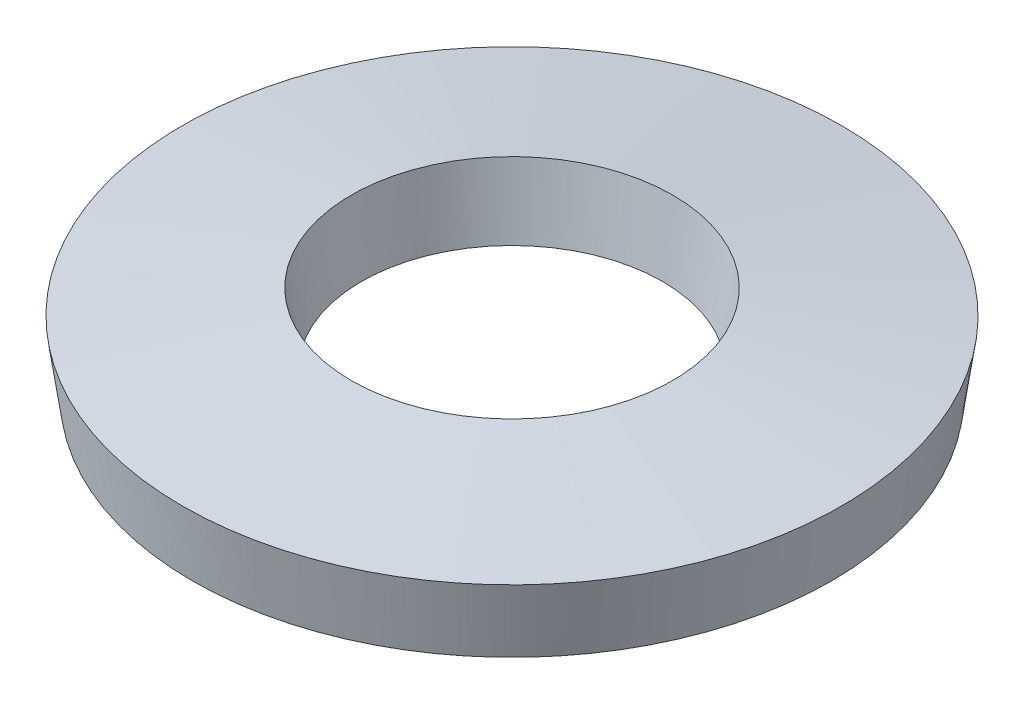
ISO-10303-21;
HEADER;
FILE_DESCRIPTION(('STEP AP214'),'2;1');
FILE_NAME('part.step','',(''),(''),'','','');
FILE_SCHEMA(('AUTOMOTIVE_DESIGN { 1 0 10303 214 1 1 1 1 }'));
ENDSEC;
DATA;
#1=APPLICATION_CONTEXT('core data for automotive mechanical design processes');
#2=APPLICATION_PROTOCOL_DEFINITION('international standard','automotive_design',2000,#1);
#3=PRODUCT_CONTEXT('',#1,'mechanical');
#4=PRODUCT('Part','Part','',(#3));
#5=PRODUCT_RELATED_PRODUCT_CATEGORY('part','',(#4));
#6=PRODUCT_DEFINITION_FORMATION('','',#4);
#7=PRODUCT_DEFINITION_CONTEXT('part definition',#1,'design');
#8=PRODUCT_DEFINITION('design','',#6,#7);
#9=PRODUCT_DEFINITION_SHAPE('','',#8);
#10=(LENGTH_UNIT() NAMED_UNIT(*) SI_UNIT(.MILLI.,.METRE.));
#11=(NAMED_UNIT(*) PLANE_ANGLE_UNIT() SI_UNIT($,.RADIAN.));
#12=(NAMED_UNIT(*) SI_UNIT($,.STERADIAN.) SOLID_ANGLE_UNIT());
#13=UNCERTAINTY_MEASURE_WITH_UNIT(LENGTH_MEASURE(1.E-05),#10,'distance_accuracy_value','');
#14=(GEOMETRIC_REPRESENTATION_CONTEXT(3) GLOBAL_UNCERTAINTY_ASSIGNED_CONTEXT((#13)) GLOBAL_UNIT_ASSIGNED_CONTEXT((#10,
#11,#12)) REPRESENTATION_CONTEXT('',''));
#15=CARTESIAN_POINT('',(0.,0.,0.));
#16=DIRECTION('',(0.,0.,1.));
#17=DIRECTION('',(1.,0.,0.));
#18=AXIS2_PLACEMENT_3D('',#15,#16,#17);
#19=CARTESIAN_POINT('',(0.,0.,0.));
#20=DIRECTION('',(0.,1.,0.));
#21=DIRECTION('',(0.,0.,1.));
#22=AXIS2_PLACEMENT_3D('',#19,#20,#21);
#23=CONICAL_SURFACE('',#22,6.786710012267,0.142676904490484);
#24=CARTESIAN_POINT('',(0.,1.48475835782556,0.));
#25=DIRECTION('',(0.,-1.,0.));
#26=DIRECTION('',(0.,0.,-1.));
#27=AXIS2_PLACEMENT_3D('',#24,#25,#26);
#28=CIRCLE('',#27,7.);
#29=CARTESIAN_POINT('',(0.,1.48475835782556,-7.));
#30=VERTEX_POINT('',#29);
#31=EDGE_CURVE('E45',#30,#30,#28,.T.);
#32=ORIENTED_EDGE('',*,*,#31,.T.);
#33=EDGE_LOOP('',(#32));
#34=FACE_BOUND('',#33,.T.);
#35=CARTESIAN_POINT('',(0.,0.,0.));
#36=DIRECTION('',(0.,-1.,0.));
#37=DIRECTION('',(0.,0.,-1.));
#38=AXIS2_PLACEMENT_3D('',#35,#36,#37);
#39=CIRCLE('',#38,6.786710012267);
#40=CARTESIAN_POINT('',(0.,0.,-6.786710012267));
#41=VERTEX_POINT('',#40);
#42=EDGE_CURVE('E10',#41,#41,#39,.T.);
#43=ORIENTED_EDGE('',*,*,#42,.F.);
#44=EDGE_LOOP('',(#43));
#45=FACE_BOUND('',#44,.T.);
#46=ADVANCED_FACE('F31',(#34,#45),#23,.T.);
#47=CARTESIAN_POINT('',(0.,0.515241642174438,0.));
#48=DIRECTION('',(0.,-1.,0.));
#49=DIRECTION('',(0.,0.,-1.));
#50=AXIS2_PLACEMENT_3D('',#47,#48,#49);
#51=CONICAL_SURFACE('',#50,3.2,1.42811942230441);
#52=ORIENTED_EDGE('',*,*,#42,.T.);
#53=EDGE_LOOP('',(#52));
#54=FACE_BOUND('',#53,.T.);
#55=CARTESIAN_POINT('',(0.,0.515241642174438,0.));
#56=DIRECTION('',(0.,-1.,0.));
#57=DIRECTION('',(0.,0.,-1.));
#58=AXIS2_PLACEMENT_3D('',#55,#56,#57);
#59=CIRCLE('',#58,3.2);
#60=CARTESIAN_POINT('',(0.,0.515241642174438,-3.2));
#61=VERTEX_POINT('',#60);
#62=EDGE_CURVE('E37',#61,#61,#59,.T.);
#63=ORIENTED_EDGE('',*,*,#62,.F.);
#64=EDGE_LOOP('',(#63));
#65=FACE_BOUND('',#64,.T.);
#66=ADVANCED_FACE('F61',(#54,#65),#51,.F.);
#67=CARTESIAN_POINT('',(0.,2.,0.));
#68=DIRECTION('',(0.,1.,0.));
#69=DIRECTION('',(0.,0.,1.));
#70=AXIS2_PLACEMENT_3D('',#67,#68,#69);
#71=CONICAL_SURFACE('',#70,3.413289987733,0.142676904490484);
#72=ORIENTED_EDGE('',*,*,#62,.T.);
#73=EDGE_LOOP('',(#72));
#74=FACE_BOUND('',#73,.T.);
#75=CARTESIAN_POINT('',(0.,2.,0.));
#76=DIRECTION('',(0.,-1.,0.));
#77=DIRECTION('',(0.,0.,-1.));
#78=AXIS2_PLACEMENT_3D('',#75,#76,#77);
#79=CIRCLE('',#78,3.413289987733);
#80=CARTESIAN_POINT('',(0.,2.,-3.413289987733));
#81=VERTEX_POINT('',#80);
#82=EDGE_CURVE('E41',#81,#81,#79,.T.);
#83=ORIENTED_EDGE('',*,*,#82,.F.);
#84=EDGE_LOOP('',(#83));
#85=FACE_BOUND('',#84,.T.);
#86=ADVANCED_FACE('F55',(#74,#85),#71,.F.);
#87=CARTESIAN_POINT('',(0.,1.48475835782556,0.));
#88=DIRECTION('',(0.,-1.,0.));
#89=DIRECTION('',(0.,0.,-1.));
#90=AXIS2_PLACEMENT_3D('',#87,#88,#89);
#91=CONICAL_SURFACE('',#90,7.,1.42811942230441);
#92=ORIENTED_EDGE('',*,*,#82,.T.);
#93=EDGE_LOOP('',(#92));
#94=FACE_BOUND('',#93,.T.);
#95=ORIENTED_EDGE('',*,*,#31,.F.);
#96=EDGE_LOOP('',(#95));
#97=FACE_BOUND('',#96,.T.);
#98=ADVANCED_FACE('F53',(#94,#97),#91,.T.);
#99=CLOSED_SHELL('',(#46,#66,#86,#98));
#100=MANIFOLD_SOLID_BREP('B2',#99);
#101=ADVANCED_BREP_SHAPE_REPRESENTATION('',(#18,#100),#14);
#102=SHAPE_DEFINITION_REPRESENTATION(#9,#101);
ENDSEC;
END-ISO-10303-21;
